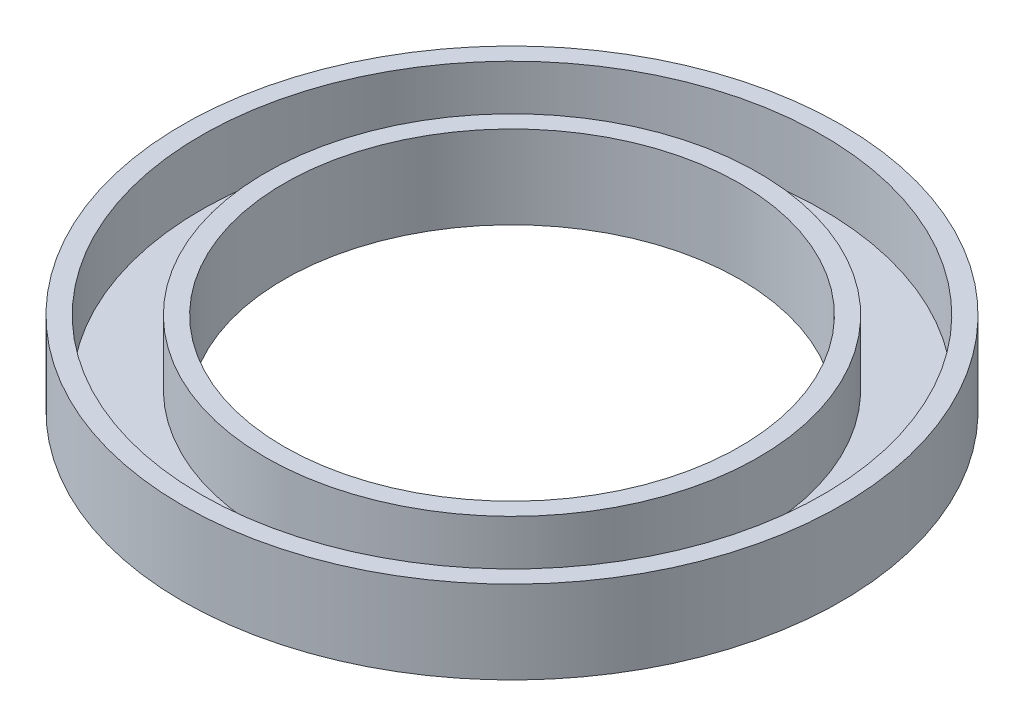
ISO-10303-21;
HEADER;
FILE_DESCRIPTION(('STEP AP214'),'2;1');
FILE_NAME('part.step','',(''),(''),'','','');
FILE_SCHEMA(('AUTOMOTIVE_DESIGN { 1 0 10303 214 1 1 1 1 }'));
ENDSEC;
DATA;
#1=APPLICATION_CONTEXT('core data for automotive mechanical design processes');
#2=APPLICATION_PROTOCOL_DEFINITION('international standard','automotive_design',2000,#1);
#3=PRODUCT_CONTEXT('',#1,'mechanical');
#4=PRODUCT('Part','Part','',(#3));
#5=PRODUCT_RELATED_PRODUCT_CATEGORY('part','',(#4));
#6=PRODUCT_DEFINITION_FORMATION('','',#4);
#7=PRODUCT_DEFINITION_CONTEXT('part definition',#1,'design');
#8=PRODUCT_DEFINITION('design','',#6,#7);
#9=PRODUCT_DEFINITION_SHAPE('','',#8);
#10=(LENGTH_UNIT() NAMED_UNIT(*) SI_UNIT(.MILLI.,.METRE.));
#11=(NAMED_UNIT(*) PLANE_ANGLE_UNIT() SI_UNIT($,.RADIAN.));
#12=(NAMED_UNIT(*) SI_UNIT($,.STERADIAN.) SOLID_ANGLE_UNIT());
#13=UNCERTAINTY_MEASURE_WITH_UNIT(LENGTH_MEASURE(1.E-05),#10,'distance_accuracy_value','');
#14=(GEOMETRIC_REPRESENTATION_CONTEXT(3) GLOBAL_UNCERTAINTY_ASSIGNED_CONTEXT((#13)) GLOBAL_UNIT_ASSIGNED_CONTEXT((#10,
#11,#12)) REPRESENTATION_CONTEXT('',''));
#15=CARTESIAN_POINT('',(0.,0.,0.));
#16=DIRECTION('',(0.,0.,1.));
#17=DIRECTION('',(1.,0.,0.));
#18=AXIS2_PLACEMENT_3D('',#15,#16,#17);
#19=CARTESIAN_POINT('',(18.4,17.2772148271161,0.));
#20=DIRECTION('',(0.,-1.,0.));
#21=DIRECTION('',(0.,0.,-1.));
#22=AXIS2_PLACEMENT_3D('',#19,#20,#21);
#23=PLANE('',#22);
#24=CARTESIAN_POINT('',(0.,17.2772148271161,0.));
#25=DIRECTION('',(0.,1.,0.));
#26=DIRECTION('',(0.,0.,1.));
#27=AXIS2_PLACEMENT_3D('',#24,#25,#26);
#28=CIRCLE('',#27,18.4);
#29=CARTESIAN_POINT('',(0.,17.2772148271161,18.4));
#30=VERTEX_POINT('',#29);
#31=EDGE_CURVE('E76',#30,#30,#28,.T.);
#32=ORIENTED_EDGE('',*,*,#31,.F.);
#33=EDGE_LOOP('',(#32));
#34=FACE_BOUND('',#33,.T.);
#35=CARTESIAN_POINT('',(0.,17.2772148271161,0.));
#36=DIRECTION('',(0.,1.,0.));
#37=DIRECTION('',(0.,0.,1.));
#38=AXIS2_PLACEMENT_3D('',#35,#36,#37);
#39=CIRCLE('',#38,19.9);
#40=CARTESIAN_POINT('',(0.,17.2772148271161,19.9));
#41=VERTEX_POINT('',#40);
#42=EDGE_CURVE('E10',#41,#41,#39,.T.);
#43=ORIENTED_EDGE('',*,*,#42,.T.);
#44=EDGE_LOOP('',(#43));
#45=FACE_BOUND('',#44,.T.);
#46=ADVANCED_FACE('F41',(#34,#45),#23,.F.);
#47=CARTESIAN_POINT('',(0.,46.7269068933477,0.));
#48=DIRECTION('',(0.,1.,0.));
#49=DIRECTION('',(0.,0.,1.));
#50=AXIS2_PLACEMENT_3D('',#47,#48,#49);
#51=CYLINDRICAL_SURFACE('',#50,19.9);
#52=ORIENTED_EDGE('',*,*,#42,.F.);
#53=EDGE_LOOP('',(#52));
#54=FACE_BOUND('',#53,.T.);
#55=CARTESIAN_POINT('',(0.,12.0772148271161,0.));
#56=DIRECTION('',(0.,1.,0.));
#57=DIRECTION('',(0.,0.,1.));
#58=AXIS2_PLACEMENT_3D('',#55,#56,#57);
#59=CIRCLE('',#58,19.9);
#60=CARTESIAN_POINT('',(0.,12.0772148271161,19.9));
#61=VERTEX_POINT('',#60);
#62=EDGE_CURVE('E48',#61,#61,#59,.T.);
#63=ORIENTED_EDGE('',*,*,#62,.T.);
#64=EDGE_LOOP('',(#63));
#65=FACE_BOUND('',#64,.T.);
#66=ADVANCED_FACE('F84',(#54,#65),#51,.T.);
#67=CARTESIAN_POINT('',(19.9,12.0772148271161,0.));
#68=DIRECTION('',(0.,-1.,0.));
#69=DIRECTION('',(0.,0.,-1.));
#70=AXIS2_PLACEMENT_3D('',#67,#68,#69);
#71=PLANE('',#70);
#72=ORIENTED_EDGE('',*,*,#62,.F.);
#73=EDGE_LOOP('',(#72));
#74=FACE_BOUND('',#73,.T.);
#75=CARTESIAN_POINT('',(0.,12.0772148271161,0.));
#76=DIRECTION('',(0.,1.,0.));
#77=DIRECTION('',(0.,0.,1.));
#78=AXIS2_PLACEMENT_3D('',#75,#76,#77);
#79=CIRCLE('',#78,25.1);
#80=CARTESIAN_POINT('',(0.,12.0772148271161,25.1));
#81=VERTEX_POINT('',#80);
#82=EDGE_CURVE('E53',#81,#81,#79,.T.);
#83=ORIENTED_EDGE('',*,*,#82,.T.);
#84=EDGE_LOOP('',(#83));
#85=FACE_BOUND('',#84,.T.);
#86=ADVANCED_FACE('F88',(#74,#85),#71,.F.);
#87=CARTESIAN_POINT('',(0.,46.7269068933477,0.));
#88=DIRECTION('',(0.,1.,0.));
#89=DIRECTION('',(0.,0.,1.));
#90=AXIS2_PLACEMENT_3D('',#87,#88,#89);
#91=CYLINDRICAL_SURFACE('',#90,25.1);
#92=ORIENTED_EDGE('',*,*,#82,.F.);
#93=EDGE_LOOP('',(#92));
#94=FACE_BOUND('',#93,.T.);
#95=CARTESIAN_POINT('',(0.,17.2772148271161,0.));
#96=DIRECTION('',(0.,1.,0.));
#97=DIRECTION('',(0.,0.,1.));
#98=AXIS2_PLACEMENT_3D('',#95,#96,#97);
#99=CIRCLE('',#98,25.1);
#100=CARTESIAN_POINT('',(0.,17.2772148271161,25.1));
#101=VERTEX_POINT('',#100);
#102=EDGE_CURVE('E58',#101,#101,#99,.T.);
#103=ORIENTED_EDGE('',*,*,#102,.T.);
#104=EDGE_LOOP('',(#103));
#105=FACE_BOUND('',#104,.T.);
#106=ADVANCED_FACE('F93',(#94,#105),#91,.F.);
#107=CARTESIAN_POINT('',(25.1,17.2772148271161,0.));
#108=DIRECTION('',(0.,-1.,0.));
#109=DIRECTION('',(0.,0.,-1.));
#110=AXIS2_PLACEMENT_3D('',#107,#108,#109);
#111=PLANE('',#110);
#112=ORIENTED_EDGE('',*,*,#102,.F.);
#113=EDGE_LOOP('',(#112));
#114=FACE_BOUND('',#113,.T.);
#115=CARTESIAN_POINT('',(0.,17.2772148271161,0.));
#116=DIRECTION('',(0.,1.,0.));
#117=DIRECTION('',(0.,0.,1.));
#118=AXIS2_PLACEMENT_3D('',#115,#116,#117);
#119=CIRCLE('',#118,26.6);
#120=CARTESIAN_POINT('',(0.,17.2772148271161,26.6));
#121=VERTEX_POINT('',#120);
#122=EDGE_CURVE('E64',#121,#121,#119,.T.);
#123=ORIENTED_EDGE('',*,*,#122,.T.);
#124=EDGE_LOOP('',(#123));
#125=FACE_BOUND('',#124,.T.);
#126=ADVANCED_FACE('F99',(#114,#125),#111,.F.);
#127=CARTESIAN_POINT('',(0.,46.7269068933477,0.));
#128=DIRECTION('',(0.,1.,0.));
#129=DIRECTION('',(0.,0.,1.));
#130=AXIS2_PLACEMENT_3D('',#127,#128,#129);
#131=CYLINDRICAL_SURFACE('',#130,26.6);
#132=ORIENTED_EDGE('',*,*,#122,.F.);
#133=EDGE_LOOP('',(#132));
#134=FACE_BOUND('',#133,.T.);
#135=CARTESIAN_POINT('',(0.,10.5772148271161,0.));
#136=DIRECTION('',(0.,1.,0.));
#137=DIRECTION('',(0.,0.,1.));
#138=AXIS2_PLACEMENT_3D('',#135,#136,#137);
#139=CIRCLE('',#138,26.6);
#140=CARTESIAN_POINT('',(0.,10.5772148271161,26.6));
#141=VERTEX_POINT('',#140);
#142=EDGE_CURVE('E68',#141,#141,#139,.T.);
#143=ORIENTED_EDGE('',*,*,#142,.T.);
#144=EDGE_LOOP('',(#143));
#145=FACE_BOUND('',#144,.T.);
#146=ADVANCED_FACE('F103',(#134,#145),#131,.T.);
#147=CARTESIAN_POINT('',(18.4,10.5772148271161,0.));
#148=DIRECTION('',(0.,1.,0.));
#149=DIRECTION('',(0.,0.,1.));
#150=AXIS2_PLACEMENT_3D('',#147,#148,#149);
#151=PLANE('',#150);
#152=ORIENTED_EDGE('',*,*,#142,.F.);
#153=EDGE_LOOP('',(#152));
#154=FACE_BOUND('',#153,.T.);
#155=CARTESIAN_POINT('',(0.,10.5772148271161,0.));
#156=DIRECTION('',(0.,1.,0.));
#157=DIRECTION('',(0.,0.,1.));
#158=AXIS2_PLACEMENT_3D('',#155,#156,#157);
#159=CIRCLE('',#158,18.4);
#160=CARTESIAN_POINT('',(0.,10.5772148271161,18.4));
#161=VERTEX_POINT('',#160);
#162=EDGE_CURVE('E72',#161,#161,#159,.T.);
#163=ORIENTED_EDGE('',*,*,#162,.T.);
#164=EDGE_LOOP('',(#163));
#165=FACE_BOUND('',#164,.T.);
#166=ADVANCED_FACE('F107',(#154,#165),#151,.F.);
#167=CARTESIAN_POINT('',(0.,46.7269068933477,0.));
#168=DIRECTION('',(0.,1.,0.));
#169=DIRECTION('',(0.,0.,1.));
#170=AXIS2_PLACEMENT_3D('',#167,#168,#169);
#171=CYLINDRICAL_SURFACE('',#170,18.4);
#172=ORIENTED_EDGE('',*,*,#162,.F.);
#173=EDGE_LOOP('',(#172));
#174=FACE_BOUND('',#173,.T.);
#175=ORIENTED_EDGE('',*,*,#31,.T.);
#176=EDGE_LOOP('',(#175));
#177=FACE_BOUND('',#176,.T.);
#178=ADVANCED_FACE('F81',(#174,#177),#171,.F.);
#179=CLOSED_SHELL('',(#46,#66,#86,#106,#126,#146,#166,#178));
#180=MANIFOLD_SOLID_BREP('B2',#179);
#181=ADVANCED_BREP_SHAPE_REPRESENTATION('',(#18,#180),#14);
#182=SHAPE_DEFINITION_REPRESENTATION(#9,#181);
ENDSEC;
END-ISO-10303-21;
